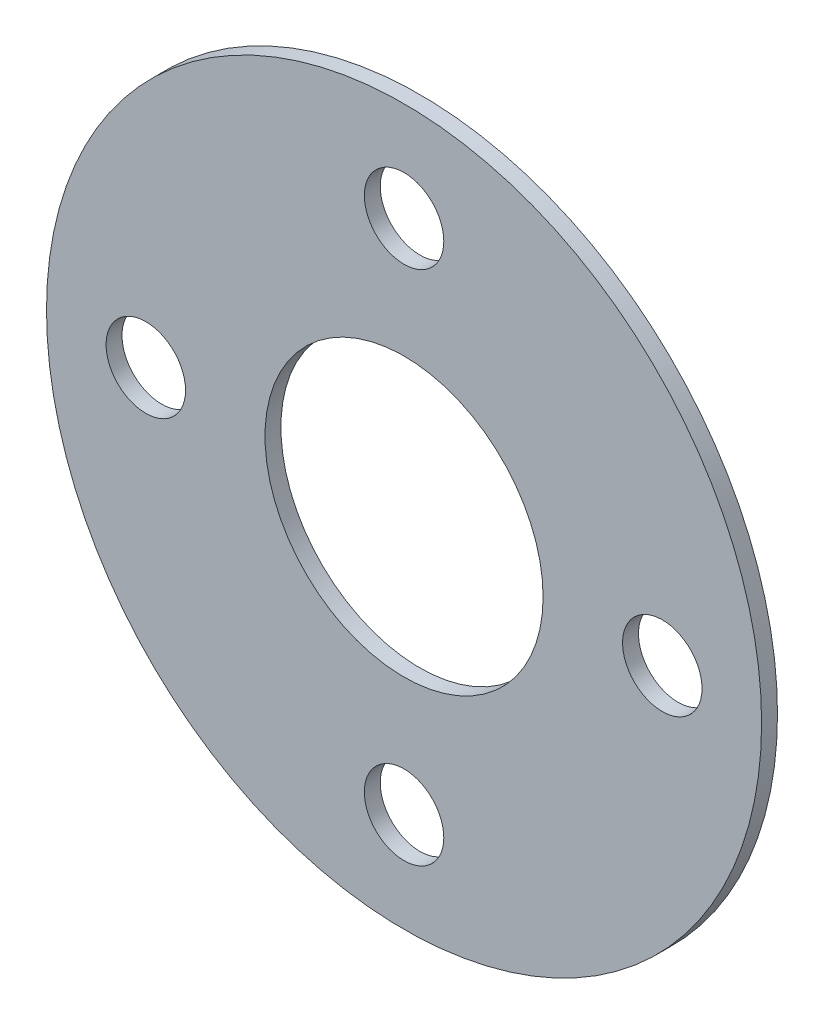
ISO-10303-21;
HEADER;
FILE_DESCRIPTION(('STEP AP214'),'2;1');
FILE_NAME('part.step','',(''),(''),'','','');
FILE_SCHEMA(('AUTOMOTIVE_DESIGN { 1 0 10303 214 1 1 1 1 }'));
ENDSEC;
DATA;
#1=APPLICATION_CONTEXT('core data for automotive mechanical design processes');
#2=APPLICATION_PROTOCOL_DEFINITION('international standard','automotive_design',2000,#1);
#3=PRODUCT_CONTEXT('',#1,'mechanical');
#4=PRODUCT('Part','Part','',(#3));
#5=PRODUCT_RELATED_PRODUCT_CATEGORY('part','',(#4));
#6=PRODUCT_DEFINITION_FORMATION('','',#4);
#7=PRODUCT_DEFINITION_CONTEXT('part definition',#1,'design');
#8=PRODUCT_DEFINITION('design','',#6,#7);
#9=PRODUCT_DEFINITION_SHAPE('','',#8);
#10=(LENGTH_UNIT() NAMED_UNIT(*) SI_UNIT(.MILLI.,.METRE.));
#11=(NAMED_UNIT(*) PLANE_ANGLE_UNIT() SI_UNIT($,.RADIAN.));
#12=(NAMED_UNIT(*) SI_UNIT($,.STERADIAN.) SOLID_ANGLE_UNIT());
#13=UNCERTAINTY_MEASURE_WITH_UNIT(LENGTH_MEASURE(1.E-05),#10,'distance_accuracy_value','');
#14=(GEOMETRIC_REPRESENTATION_CONTEXT(3) GLOBAL_UNCERTAINTY_ASSIGNED_CONTEXT((#13)) GLOBAL_UNIT_ASSIGNED_CONTEXT((#10,
#11,#12)) REPRESENTATION_CONTEXT('',''));
#15=CARTESIAN_POINT('',(0.,0.,0.));
#16=DIRECTION('',(0.,0.,1.));
#17=DIRECTION('',(1.,0.,0.));
#18=AXIS2_PLACEMENT_3D('',#15,#16,#17);
#19=CARTESIAN_POINT('',(0.,0.,2.));
#20=DIRECTION('',(0.,0.,1.));
#21=DIRECTION('',(1.,0.,0.));
#22=AXIS2_PLACEMENT_3D('',#19,#20,#21);
#23=PLANE('',#22);
#24=CARTESIAN_POINT('',(0.,0.,2.));
#25=DIRECTION('',(0.,0.,1.));
#26=DIRECTION('',(1.,0.,0.));
#27=AXIS2_PLACEMENT_3D('',#24,#25,#26);
#28=CIRCLE('',#27,17.5);
#29=CARTESIAN_POINT('',(17.5,0.,2.));
#30=VERTEX_POINT('',#29);
#31=EDGE_CURVE('E80',#30,#30,#28,.T.);
#32=ORIENTED_EDGE('',*,*,#31,.F.);
#33=EDGE_LOOP('',(#32));
#34=FACE_BOUND('',#33,.T.);
#35=CARTESIAN_POINT('',(-2.26946287024804E-13,-32.5,2.));
#36=DIRECTION('',(0.,0.,1.));
#37=DIRECTION('',(1.,0.,0.));
#38=AXIS2_PLACEMENT_3D('',#35,#36,#37);
#39=CIRCLE('',#38,5.);
#40=CARTESIAN_POINT('',(4.99999999999977,-32.5,2.));
#41=VERTEX_POINT('',#40);
#42=EDGE_CURVE('E65',#41,#41,#39,.T.);
#43=ORIENTED_EDGE('',*,*,#42,.F.);
#44=EDGE_LOOP('',(#43));
#45=FACE_BOUND('',#44,.T.);
#46=CARTESIAN_POINT('',(0.,32.5,2.));
#47=DIRECTION('',(0.,0.,1.));
#48=DIRECTION('',(1.,0.,0.));
#49=AXIS2_PLACEMENT_3D('',#46,#47,#48);
#50=CIRCLE('',#49,5.);
#51=CARTESIAN_POINT('',(5.,32.5,2.));
#52=VERTEX_POINT('',#51);
#53=EDGE_CURVE('E54',#52,#52,#50,.T.);
#54=ORIENTED_EDGE('',*,*,#53,.F.);
#55=EDGE_LOOP('',(#54));
#56=FACE_BOUND('',#55,.T.);
#57=CARTESIAN_POINT('',(0.,0.,2.));
#58=DIRECTION('',(0.,0.,1.));
#59=DIRECTION('',(1.,0.,0.));
#60=AXIS2_PLACEMENT_3D('',#57,#58,#59);
#61=CIRCLE('',#60,45.);
#62=CARTESIAN_POINT('',(45.,0.,2.));
#63=VERTEX_POINT('',#62);
#64=EDGE_CURVE('E10',#63,#63,#61,.T.);
#65=ORIENTED_EDGE('',*,*,#64,.T.);
#66=EDGE_LOOP('',(#65));
#67=FACE_BOUND('',#66,.T.);
#68=CARTESIAN_POINT('',(32.5,-1.13473143512402E-13,2.));
#69=DIRECTION('',(0.,0.,1.));
#70=DIRECTION('',(1.,0.,0.));
#71=AXIS2_PLACEMENT_3D('',#68,#69,#70);
#72=CIRCLE('',#71,5.);
#73=CARTESIAN_POINT('',(37.5,-1.13473143512402E-13,2.));
#74=VERTEX_POINT('',#73);
#75=EDGE_CURVE('E59',#74,#74,#72,.T.);
#76=ORIENTED_EDGE('',*,*,#75,.F.);
#77=EDGE_LOOP('',(#76));
#78=FACE_BOUND('',#77,.T.);
#79=CARTESIAN_POINT('',(-32.5,3.40419430537206E-13,2.));
#80=DIRECTION('',(0.,0.,1.));
#81=DIRECTION('',(1.,0.,0.));
#82=AXIS2_PLACEMENT_3D('',#79,#80,#81);
#83=CIRCLE('',#82,5.);
#84=CARTESIAN_POINT('',(-27.5,3.40419430537206E-13,2.));
#85=VERTEX_POINT('',#84);
#86=EDGE_CURVE('E71',#85,#85,#83,.T.);
#87=ORIENTED_EDGE('',*,*,#86,.F.);
#88=EDGE_LOOP('',(#87));
#89=FACE_BOUND('',#88,.T.);
#90=ADVANCED_FACE('F43',(#34,#45,#56,#67,#78,#89),#23,.T.);
#91=CARTESIAN_POINT('',(0.,0.,0.));
#92=DIRECTION('',(0.,0.,1.));
#93=DIRECTION('',(1.,0.,0.));
#94=AXIS2_PLACEMENT_3D('',#91,#92,#93);
#95=PLANE('',#94);
#96=CARTESIAN_POINT('',(0.,0.,0.));
#97=DIRECTION('',(0.,0.,1.));
#98=DIRECTION('',(1.,0.,0.));
#99=AXIS2_PLACEMENT_3D('',#96,#97,#98);
#100=CIRCLE('',#99,17.5);
#101=CARTESIAN_POINT('',(17.5,0.,0.));
#102=VERTEX_POINT('',#101);
#103=EDGE_CURVE('E77',#102,#102,#100,.T.);
#104=ORIENTED_EDGE('',*,*,#103,.T.);
#105=EDGE_LOOP('',(#104));
#106=FACE_BOUND('',#105,.T.);
#107=CARTESIAN_POINT('',(0.,0.,0.));
#108=DIRECTION('',(0.,0.,1.));
#109=DIRECTION('',(1.,0.,0.));
#110=AXIS2_PLACEMENT_3D('',#107,#108,#109);
#111=CIRCLE('',#110,45.);
#112=CARTESIAN_POINT('',(45.,0.,0.));
#113=VERTEX_POINT('',#112);
#114=EDGE_CURVE('E47',#113,#113,#111,.T.);
#115=ORIENTED_EDGE('',*,*,#114,.F.);
#116=EDGE_LOOP('',(#115));
#117=FACE_BOUND('',#116,.T.);
#118=CARTESIAN_POINT('',(0.,32.5,0.));
#119=DIRECTION('',(0.,0.,1.));
#120=DIRECTION('',(1.,0.,0.));
#121=AXIS2_PLACEMENT_3D('',#118,#119,#120);
#122=CIRCLE('',#121,5.);
#123=CARTESIAN_POINT('',(5.,32.5,0.));
#124=VERTEX_POINT('',#123);
#125=EDGE_CURVE('E56',#124,#124,#122,.T.);
#126=ORIENTED_EDGE('',*,*,#125,.T.);
#127=EDGE_LOOP('',(#126));
#128=FACE_BOUND('',#127,.T.);
#129=CARTESIAN_POINT('',(32.5,-1.13473143512402E-13,0.));
#130=DIRECTION('',(0.,0.,1.));
#131=DIRECTION('',(1.,0.,0.));
#132=AXIS2_PLACEMENT_3D('',#129,#130,#131);
#133=CIRCLE('',#132,5.);
#134=CARTESIAN_POINT('',(37.5,-1.13473143512402E-13,0.));
#135=VERTEX_POINT('',#134);
#136=EDGE_CURVE('E62',#135,#135,#133,.T.);
#137=ORIENTED_EDGE('',*,*,#136,.T.);
#138=EDGE_LOOP('',(#137));
#139=FACE_BOUND('',#138,.T.);
#140=CARTESIAN_POINT('',(-2.26946287024804E-13,-32.5,0.));
#141=DIRECTION('',(0.,0.,1.));
#142=DIRECTION('',(1.,0.,0.));
#143=AXIS2_PLACEMENT_3D('',#140,#141,#142);
#144=CIRCLE('',#143,5.);
#145=CARTESIAN_POINT('',(4.99999999999977,-32.5,0.));
#146=VERTEX_POINT('',#145);
#147=EDGE_CURVE('E68',#146,#146,#144,.T.);
#148=ORIENTED_EDGE('',*,*,#147,.T.);
#149=EDGE_LOOP('',(#148));
#150=FACE_BOUND('',#149,.T.);
#151=CARTESIAN_POINT('',(-32.5,3.40419430537206E-13,0.));
#152=DIRECTION('',(0.,0.,1.));
#153=DIRECTION('',(1.,0.,0.));
#154=AXIS2_PLACEMENT_3D('',#151,#152,#153);
#155=CIRCLE('',#154,5.);
#156=CARTESIAN_POINT('',(-27.5,3.40419430537206E-13,0.));
#157=VERTEX_POINT('',#156);
#158=EDGE_CURVE('E74',#157,#157,#155,.T.);
#159=ORIENTED_EDGE('',*,*,#158,.T.);
#160=EDGE_LOOP('',(#159));
#161=FACE_BOUND('',#160,.T.);
#162=ADVANCED_FACE('F86',(#106,#117,#128,#139,#150,#161),#95,.F.);
#163=CARTESIAN_POINT('',(0.,0.,2.));
#164=DIRECTION('',(0.,0.,-1.));
#165=DIRECTION('',(-1.,0.,0.));
#166=AXIS2_PLACEMENT_3D('',#163,#164,#165);
#167=CYLINDRICAL_SURFACE('',#166,45.);
#168=ORIENTED_EDGE('',*,*,#64,.F.);
#169=EDGE_LOOP('',(#168));
#170=FACE_BOUND('',#169,.T.);
#171=ORIENTED_EDGE('',*,*,#114,.T.);
#172=EDGE_LOOP('',(#171));
#173=FACE_BOUND('',#172,.T.);
#174=ADVANCED_FACE('F45',(#170,#173),#167,.T.);
#175=CARTESIAN_POINT('',(0.,32.5,2.));
#176=DIRECTION('',(0.,0.,-1.));
#177=DIRECTION('',(-1.,0.,0.));
#178=AXIS2_PLACEMENT_3D('',#175,#176,#177);
#179=CYLINDRICAL_SURFACE('',#178,5.);
#180=ORIENTED_EDGE('',*,*,#53,.T.);
#181=EDGE_LOOP('',(#180));
#182=FACE_BOUND('',#181,.T.);
#183=ORIENTED_EDGE('',*,*,#125,.F.);
#184=EDGE_LOOP('',(#183));
#185=FACE_BOUND('',#184,.T.);
#186=ADVANCED_FACE('F118',(#182,#185),#179,.F.);
#187=CARTESIAN_POINT('',(32.5,-1.13473143512402E-13,2.));
#188=DIRECTION('',(0.,0.,-1.));
#189=DIRECTION('',(-1.,0.,0.));
#190=AXIS2_PLACEMENT_3D('',#187,#188,#189);
#191=CYLINDRICAL_SURFACE('',#190,5.);
#192=ORIENTED_EDGE('',*,*,#75,.T.);
#193=EDGE_LOOP('',(#192));
#194=FACE_BOUND('',#193,.T.);
#195=ORIENTED_EDGE('',*,*,#136,.F.);
#196=EDGE_LOOP('',(#195));
#197=FACE_BOUND('',#196,.T.);
#198=ADVANCED_FACE('F123',(#194,#197),#191,.F.);
#199=CARTESIAN_POINT('',(-2.26946287024804E-13,-32.5,2.));
#200=DIRECTION('',(0.,0.,-1.));
#201=DIRECTION('',(-1.,0.,0.));
#202=AXIS2_PLACEMENT_3D('',#199,#200,#201);
#203=CYLINDRICAL_SURFACE('',#202,5.);
#204=ORIENTED_EDGE('',*,*,#42,.T.);
#205=EDGE_LOOP('',(#204));
#206=FACE_BOUND('',#205,.T.);
#207=ORIENTED_EDGE('',*,*,#147,.F.);
#208=EDGE_LOOP('',(#207));
#209=FACE_BOUND('',#208,.T.);
#210=ADVANCED_FACE('F109',(#206,#209),#203,.F.);
#211=CARTESIAN_POINT('',(-32.5,3.40419430537206E-13,2.));
#212=DIRECTION('',(0.,0.,-1.));
#213=DIRECTION('',(-1.,0.,0.));
#214=AXIS2_PLACEMENT_3D('',#211,#212,#213);
#215=CYLINDRICAL_SURFACE('',#214,5.);
#216=ORIENTED_EDGE('',*,*,#86,.T.);
#217=EDGE_LOOP('',(#216));
#218=FACE_BOUND('',#217,.T.);
#219=ORIENTED_EDGE('',*,*,#158,.F.);
#220=EDGE_LOOP('',(#219));
#221=FACE_BOUND('',#220,.T.);
#222=ADVANCED_FACE('F92',(#218,#221),#215,.F.);
#223=CARTESIAN_POINT('',(0.,0.,0.));
#224=DIRECTION('',(0.,0.,1.));
#225=DIRECTION('',(1.,0.,0.));
#226=AXIS2_PLACEMENT_3D('',#223,#224,#225);
#227=CYLINDRICAL_SURFACE('',#226,17.5);
#228=ORIENTED_EDGE('',*,*,#103,.F.);
#229=EDGE_LOOP('',(#228));
#230=FACE_BOUND('',#229,.T.);
#231=ORIENTED_EDGE('',*,*,#31,.T.);
#232=EDGE_LOOP('',(#231));
#233=FACE_BOUND('',#232,.T.);
#234=ADVANCED_FACE('F89',(#230,#233),#227,.F.);
#235=CLOSED_SHELL('',(#90,#162,#174,#186,#198,#210,#222,#234));
#236=MANIFOLD_SOLID_BREP('B2',#235);
#237=ADVANCED_BREP_SHAPE_REPRESENTATION('',(#18,#236),#14);
#238=SHAPE_DEFINITION_REPRESENTATION(#9,#237);
ENDSEC;
END-ISO-10303-21;
